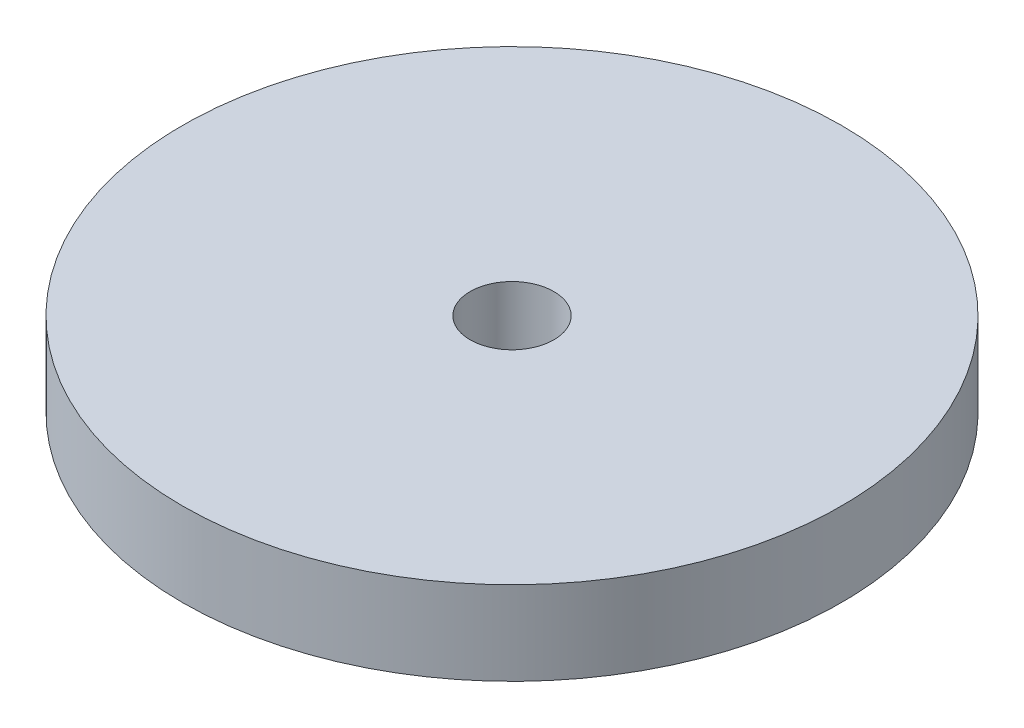
ISO-10303-21;
HEADER;
FILE_DESCRIPTION(('STEP AP214'),'2;1');
FILE_NAME('part.step','',(''),(''),'','','');
FILE_SCHEMA(('AUTOMOTIVE_DESIGN { 1 0 10303 214 1 1 1 1 }'));
ENDSEC;
DATA;
#1=APPLICATION_CONTEXT('core data for automotive mechanical design processes');
#2=APPLICATION_PROTOCOL_DEFINITION('international standard','automotive_design',2000,#1);
#3=PRODUCT_CONTEXT('',#1,'mechanical');
#4=PRODUCT('Part','Part','',(#3));
#5=PRODUCT_RELATED_PRODUCT_CATEGORY('part','',(#4));
#6=PRODUCT_DEFINITION_FORMATION('','',#4);
#7=PRODUCT_DEFINITION_CONTEXT('part definition',#1,'design');
#8=PRODUCT_DEFINITION('design','',#6,#7);
#9=PRODUCT_DEFINITION_SHAPE('','',#8);
#10=(LENGTH_UNIT() NAMED_UNIT(*) SI_UNIT(.MILLI.,.METRE.));
#11=(NAMED_UNIT(*) PLANE_ANGLE_UNIT() SI_UNIT($,.RADIAN.));
#12=(NAMED_UNIT(*) SI_UNIT($,.STERADIAN.) SOLID_ANGLE_UNIT());
#13=UNCERTAINTY_MEASURE_WITH_UNIT(LENGTH_MEASURE(1.E-05),#10,'distance_accuracy_value','');
#14=(GEOMETRIC_REPRESENTATION_CONTEXT(3) GLOBAL_UNCERTAINTY_ASSIGNED_CONTEXT((#13)) GLOBAL_UNIT_ASSIGNED_CONTEXT((#10,
#11,#12)) REPRESENTATION_CONTEXT('',''));
#15=CARTESIAN_POINT('',(0.,0.,0.));
#16=DIRECTION('',(0.,0.,1.));
#17=DIRECTION('',(1.,0.,0.));
#18=AXIS2_PLACEMENT_3D('',#15,#16,#17);
#19=CARTESIAN_POINT('',(0.,6.35,0.));
#20=DIRECTION('',(0.,-1.,0.));
#21=DIRECTION('',(0.,0.,-1.));
#22=AXIS2_PLACEMENT_3D('',#19,#20,#21);
#23=CYLINDRICAL_SURFACE('',#22,25.);
#24=CARTESIAN_POINT('',(0.,6.35,0.));
#25=DIRECTION('',(0.,1.,0.));
#26=DIRECTION('',(0.,0.,1.));
#27=AXIS2_PLACEMENT_3D('',#24,#25,#26);
#28=CIRCLE('',#27,25.);
#29=CARTESIAN_POINT('',(0.,6.35,25.));
#30=VERTEX_POINT('',#29);
#31=EDGE_CURVE('E10',#30,#30,#28,.T.);
#32=ORIENTED_EDGE('',*,*,#31,.F.);
#33=EDGE_LOOP('',(#32));
#34=FACE_BOUND('',#33,.T.);
#35=CARTESIAN_POINT('',(0.,0.,0.));
#36=DIRECTION('',(0.,1.,0.));
#37=DIRECTION('',(0.,0.,1.));
#38=AXIS2_PLACEMENT_3D('',#35,#36,#37);
#39=CIRCLE('',#38,25.);
#40=CARTESIAN_POINT('',(0.,0.,25.));
#41=VERTEX_POINT('',#40);
#42=EDGE_CURVE('E40',#41,#41,#39,.T.);
#43=ORIENTED_EDGE('',*,*,#42,.T.);
#44=EDGE_LOOP('',(#43));
#45=FACE_BOUND('',#44,.T.);
#46=ADVANCED_FACE('F37',(#34,#45),#23,.T.);
#47=CARTESIAN_POINT('',(0.,6.35,0.));
#48=DIRECTION('',(0.,1.,0.));
#49=DIRECTION('',(0.,0.,1.));
#50=AXIS2_PLACEMENT_3D('',#47,#48,#49);
#51=PLANE('',#50);
#52=CARTESIAN_POINT('',(0.,6.35,0.));
#53=DIRECTION('',(0.,1.,0.));
#54=DIRECTION('',(0.,0.,1.));
#55=AXIS2_PLACEMENT_3D('',#52,#53,#54);
#56=CIRCLE('',#55,3.175);
#57=CARTESIAN_POINT('',(0.,6.35,3.175));
#58=VERTEX_POINT('',#57);
#59=EDGE_CURVE('E54',#58,#58,#56,.T.);
#60=ORIENTED_EDGE('',*,*,#59,.F.);
#61=EDGE_LOOP('',(#60));
#62=FACE_BOUND('',#61,.T.);
#63=ORIENTED_EDGE('',*,*,#31,.T.);
#64=EDGE_LOOP('',(#63));
#65=FACE_BOUND('',#64,.T.);
#66=ADVANCED_FACE('F62',(#62,#65),#51,.T.);
#67=CARTESIAN_POINT('',(0.,0.,0.));
#68=DIRECTION('',(0.,1.,0.));
#69=DIRECTION('',(0.,0.,1.));
#70=AXIS2_PLACEMENT_3D('',#67,#68,#69);
#71=PLANE('',#70);
#72=CARTESIAN_POINT('',(0.,0.,0.));
#73=DIRECTION('',(0.,1.,0.));
#74=DIRECTION('',(0.,0.,1.));
#75=AXIS2_PLACEMENT_3D('',#72,#73,#74);
#76=CIRCLE('',#75,3.175);
#77=CARTESIAN_POINT('',(0.,0.,3.175));
#78=VERTEX_POINT('',#77);
#79=EDGE_CURVE('E49',#78,#78,#76,.F.);
#80=ORIENTED_EDGE('',*,*,#79,.F.);
#81=EDGE_LOOP('',(#80));
#82=FACE_BOUND('',#81,.T.);
#83=ORIENTED_EDGE('',*,*,#42,.F.);
#84=EDGE_LOOP('',(#83));
#85=FACE_BOUND('',#84,.T.);
#86=ADVANCED_FACE('F64',(#82,#85),#71,.F.);
#87=CARTESIAN_POINT('',(0.,-0.00100000000000013,0.));
#88=DIRECTION('',(0.,1.,0.));
#89=DIRECTION('',(0.,0.,1.));
#90=AXIS2_PLACEMENT_3D('',#87,#88,#89);
#91=CYLINDRICAL_SURFACE('',#90,3.175);
#92=ORIENTED_EDGE('',*,*,#59,.T.);
#93=EDGE_LOOP('',(#92));
#94=FACE_BOUND('',#93,.T.);
#95=ORIENTED_EDGE('',*,*,#79,.T.);
#96=EDGE_LOOP('',(#95));
#97=FACE_BOUND('',#96,.T.);
#98=ADVANCED_FACE('F59',(#94,#97),#91,.F.);
#99=CLOSED_SHELL('',(#46,#66,#86,#98));
#100=MANIFOLD_SOLID_BREP('B2',#99);
#101=ADVANCED_BREP_SHAPE_REPRESENTATION('',(#18,#100),#14);
#102=SHAPE_DEFINITION_REPRESENTATION(#9,#101);
ENDSEC;
END-ISO-10303-21;
